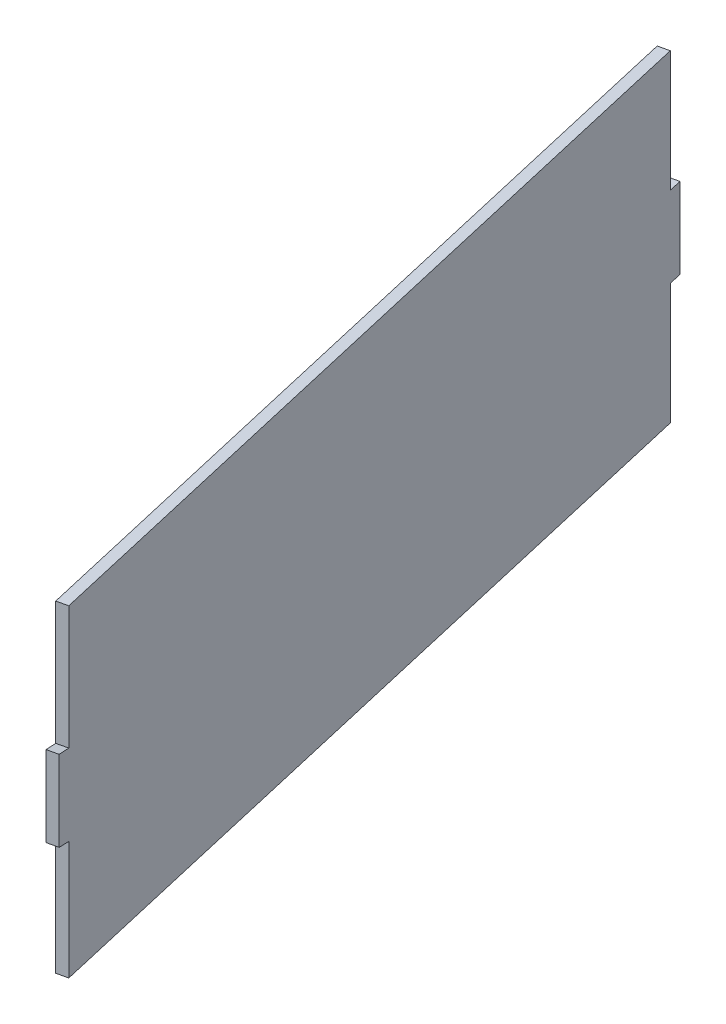
ISO-10303-21;
HEADER;
FILE_DESCRIPTION(('STEP AP214'),'2;1');
FILE_NAME('part.step','',(''),(''),'','','');
FILE_SCHEMA(('AUTOMOTIVE_DESIGN { 1 0 10303 214 1 1 1 1 }'));
ENDSEC;
DATA;
#1=APPLICATION_CONTEXT('core data for automotive mechanical design processes');
#2=APPLICATION_PROTOCOL_DEFINITION('international standard','automotive_design',2000,#1);
#3=PRODUCT_CONTEXT('',#1,'mechanical');
#4=PRODUCT('Part','Part','',(#3));
#5=PRODUCT_RELATED_PRODUCT_CATEGORY('part','',(#4));
#6=PRODUCT_DEFINITION_FORMATION('','',#4);
#7=PRODUCT_DEFINITION_CONTEXT('part definition',#1,'design');
#8=PRODUCT_DEFINITION('design','',#6,#7);
#9=PRODUCT_DEFINITION_SHAPE('','',#8);
#10=(LENGTH_UNIT() NAMED_UNIT(*) SI_UNIT(.MILLI.,.METRE.));
#11=(NAMED_UNIT(*) PLANE_ANGLE_UNIT() SI_UNIT($,.RADIAN.));
#12=(NAMED_UNIT(*) SI_UNIT($,.STERADIAN.) SOLID_ANGLE_UNIT());
#13=UNCERTAINTY_MEASURE_WITH_UNIT(LENGTH_MEASURE(1.E-05),#10,'distance_accuracy_value','');
#14=(GEOMETRIC_REPRESENTATION_CONTEXT(3) GLOBAL_UNCERTAINTY_ASSIGNED_CONTEXT((#13)) GLOBAL_UNIT_ASSIGNED_CONTEXT((#10,
#11,#12)) REPRESENTATION_CONTEXT('',''));
#15=CARTESIAN_POINT('',(0.,0.,0.));
#16=DIRECTION('',(0.,0.,1.));
#17=DIRECTION('',(1.,0.,0.));
#18=AXIS2_PLACEMENT_3D('',#15,#16,#17);
#19=CARTESIAN_POINT('',(242.32124406599,-154.081628831697,-2778.07964852124));
#20=DIRECTION('',(0.,1.,0.));
#21=DIRECTION('',(-1.,0.,0.));
#22=AXIS2_PLACEMENT_3D('',#19,#20,#21);
#23=PLANE('',#22);
#24=DIRECTION('',(0.224432003343937,0.,0.974489751549511));
#25=VECTOR('',#24,1.);
#26=CARTESIAN_POINT('',(252.222059941733,-154.081628831697,-2780.35987767521));
#27=LINE('',#26,#25);
#28=CARTESIAN_POINT('',(249.528875901606,-154.081628831697,-2792.05375469381));
#29=VERTEX_POINT('',#28);
#30=CARTESIAN_POINT('',(252.222059941733,-154.081628831697,-2780.35987767521));
#31=VERTEX_POINT('',#30);
#32=EDGE_CURVE('E160',#29,#31,#27,.T.);
#33=ORIENTED_EDGE('',*,*,#32,.F.);
#34=DIRECTION('',(0.974489751549511,0.,-0.224432003343935));
#35=VECTOR('',#34,1.);
#36=CARTESIAN_POINT('',(239.628060025863,-154.081628831697,-2789.77352553983));
#37=LINE('',#36,#35);
#38=CARTESIAN_POINT('',(239.628060025863,-154.081628831697,-2789.77352553983));
#39=VERTEX_POINT('',#38);
#40=EDGE_CURVE('E11',#39,#29,#37,.T.);
#41=ORIENTED_EDGE('',*,*,#40,.F.);
#42=DIRECTION('',(0.224432003343937,0.,0.974489751549511));
#43=VECTOR('',#42,1.);
#44=CARTESIAN_POINT('',(242.32124406599,-154.081628831697,-2778.07964852124));
#45=LINE('',#44,#43);
#46=CARTESIAN_POINT('',(242.32124406599,-154.081628831697,-2778.07964852124));
#47=VERTEX_POINT('',#46);
#48=EDGE_CURVE('E192',#39,#47,#45,.T.);
#49=ORIENTED_EDGE('',*,*,#48,.T.);
#50=DIRECTION('',(0.974489751549511,0.,-0.224432003343935));
#51=VECTOR('',#50,1.);
#52=CARTESIAN_POINT('',(242.32124406599,-154.081628831697,-2778.07964852124));
#53=LINE('',#52,#51);
#54=EDGE_CURVE('E42',#47,#31,#53,.T.);
#55=ORIENTED_EDGE('',*,*,#54,.T.);
#56=EDGE_LOOP('',(#33,#41,#49,#55));
#57=FACE_BOUND('',#56,.T.);
#58=ADVANCED_FACE('F39',(#57),#23,.T.);
#59=CARTESIAN_POINT('',(239.628060025863,-154.081628831697,-2789.77352553983));
#60=DIRECTION('',(-0.224432003343935,0.,-0.974489751549511));
#61=DIRECTION('',(-0.974489751549511,0.,0.224432003343935));
#62=AXIS2_PLACEMENT_3D('',#59,#60,#61);
#63=PLANE('',#62);
#64=DIRECTION('',(0.,1.,0.));
#65=VECTOR('',#64,1.);
#66=CARTESIAN_POINT('',(249.528875901606,-154.081628831697,-2792.05375469381));
#67=LINE('',#66,#65);
#68=CARTESIAN_POINT('',(249.528875901606,-229.081628831698,-2792.05375469381));
#69=VERTEX_POINT('',#68);
#70=EDGE_CURVE('E190',#69,#29,#67,.T.);
#71=ORIENTED_EDGE('',*,*,#70,.F.);
#72=DIRECTION('',(0.974489751549511,0.,-0.224432003343935));
#73=VECTOR('',#72,1.);
#74=CARTESIAN_POINT('',(239.628060025863,-229.081628831698,-2789.77352553983));
#75=LINE('',#74,#73);
#76=CARTESIAN_POINT('',(239.628060025863,-229.081628831698,-2789.77352553983));
#77=VERTEX_POINT('',#76);
#78=EDGE_CURVE('E48',#77,#69,#75,.T.);
#79=ORIENTED_EDGE('',*,*,#78,.F.);
#80=DIRECTION('',(0.,1.,0.));
#81=VECTOR('',#80,1.);
#82=CARTESIAN_POINT('',(239.628060025863,-154.081628831697,-2789.77352553983));
#83=LINE('',#82,#81);
#84=EDGE_CURVE('E150',#77,#39,#83,.T.);
#85=ORIENTED_EDGE('',*,*,#84,.T.);
#86=ORIENTED_EDGE('',*,*,#40,.T.);
#87=EDGE_LOOP('',(#71,#79,#85,#86));
#88=FACE_BOUND('',#87,.T.);
#89=ADVANCED_FACE('F212',(#88),#63,.T.);
#90=CARTESIAN_POINT('',(239.628060025863,-229.081628831698,-2789.77352553983));
#91=DIRECTION('',(0.,-1.,0.));
#92=DIRECTION('',(1.,0.,0.));
#93=AXIS2_PLACEMENT_3D('',#90,#91,#92);
#94=PLANE('',#93);
#95=DIRECTION('',(-0.224432003343937,0.,-0.974489751549511));
#96=VECTOR('',#95,1.);
#97=CARTESIAN_POINT('',(249.528875901606,-229.081628831698,-2792.05375469381));
#98=LINE('',#97,#96);
#99=CARTESIAN_POINT('',(252.222059941733,-229.081628831698,-2780.35987767521));
#100=VERTEX_POINT('',#99);
#101=EDGE_CURVE('E137',#100,#69,#98,.T.);
#102=ORIENTED_EDGE('',*,*,#101,.F.);
#103=DIRECTION('',(0.974489751549511,0.,-0.224432003343935));
#104=VECTOR('',#103,1.);
#105=CARTESIAN_POINT('',(242.32124406599,-229.081628831698,-2778.07964852124));
#106=LINE('',#105,#104);
#107=CARTESIAN_POINT('',(242.32124406599,-229.081628831698,-2778.07964852124));
#108=VERTEX_POINT('',#107);
#109=EDGE_CURVE('E132',#108,#100,#106,.T.);
#110=ORIENTED_EDGE('',*,*,#109,.F.);
#111=DIRECTION('',(-0.224432003343937,0.,-0.974489751549511));
#112=VECTOR('',#111,1.);
#113=CARTESIAN_POINT('',(239.628060025863,-229.081628831698,-2789.77352553983));
#114=LINE('',#113,#112);
#115=EDGE_CURVE('E135',#108,#77,#114,.T.);
#116=ORIENTED_EDGE('',*,*,#115,.T.);
#117=ORIENTED_EDGE('',*,*,#78,.T.);
#118=EDGE_LOOP('',(#102,#110,#116,#117));
#119=FACE_BOUND('',#118,.T.);
#120=ADVANCED_FACE('F134',(#119),#94,.T.);
#121=CARTESIAN_POINT('',(242.32124406599,-229.081628831698,-2778.07964852124));
#122=DIRECTION('',(-0.224432003343935,0.,-0.974489751549511));
#123=DIRECTION('',(-0.974489751549511,0.,0.224432003343935));
#124=AXIS2_PLACEMENT_3D('',#121,#122,#123);
#125=PLANE('',#124);
#126=DIRECTION('',(0.,1.,0.));
#127=VECTOR('',#126,1.);
#128=CARTESIAN_POINT('',(252.222059941733,-229.081628831698,-2780.35987767521));
#129=LINE('',#128,#127);
#130=CARTESIAN_POINT('',(252.222059941733,-341.581628831697,-2780.35987767521));
#131=VERTEX_POINT('',#130);
#132=EDGE_CURVE('E187',#131,#100,#129,.T.);
#133=ORIENTED_EDGE('',*,*,#132,.F.);
#134=DIRECTION('',(0.974489751549511,0.,-0.224432003343935));
#135=VECTOR('',#134,1.);
#136=CARTESIAN_POINT('',(242.32124406599,-341.581628831697,-2778.07964852124));
#137=LINE('',#136,#135);
#138=CARTESIAN_POINT('',(242.32124406599,-341.581628831697,-2778.07964852124));
#139=VERTEX_POINT('',#138);
#140=EDGE_CURVE('E142',#139,#131,#137,.T.);
#141=ORIENTED_EDGE('',*,*,#140,.F.);
#142=DIRECTION('',(0.,1.,0.));
#143=VECTOR('',#142,1.);
#144=CARTESIAN_POINT('',(242.32124406599,-229.081628831698,-2778.07964852124));
#145=LINE('',#144,#143);
#146=EDGE_CURVE('E148',#139,#108,#145,.T.);
#147=ORIENTED_EDGE('',*,*,#146,.T.);
#148=ORIENTED_EDGE('',*,*,#109,.T.);
#149=EDGE_LOOP('',(#133,#141,#147,#148));
#150=FACE_BOUND('',#149,.T.);
#151=ADVANCED_FACE('F152',(#150),#125,.T.);
#152=CARTESIAN_POINT('',(242.32124406599,-341.581628831697,-2778.07964852124));
#153=DIRECTION('',(0.,-1.,0.));
#154=DIRECTION('',(1.,0.,0.));
#155=AXIS2_PLACEMENT_3D('',#152,#153,#154);
#156=PLANE('',#155);
#157=DIRECTION('',(-0.224432003343935,0.,-0.974489751549511));
#158=VECTOR('',#157,1.);
#159=CARTESIAN_POINT('',(252.222059941733,-341.581628831697,-2780.35987767521));
#160=LINE('',#159,#158);
#161=CARTESIAN_POINT('',(419.721789204409,-341.581628831697,-2053.07158045472));
#162=VERTEX_POINT('',#161);
#163=EDGE_CURVE('E184',#162,#131,#160,.T.);
#164=ORIENTED_EDGE('',*,*,#163,.F.);
#165=DIRECTION('',(0.974489751549511,0.,-0.224432003343935));
#166=VECTOR('',#165,1.);
#167=CARTESIAN_POINT('',(409.820973328666,-341.581628831697,-2050.79135130074));
#168=LINE('',#167,#166);
#169=CARTESIAN_POINT('',(409.820973328666,-341.581628831697,-2050.79135130074));
#170=VERTEX_POINT('',#169);
#171=EDGE_CURVE('E196',#170,#162,#168,.T.);
#172=ORIENTED_EDGE('',*,*,#171,.F.);
#173=DIRECTION('',(-0.224432003343935,0.,-0.974489751549511));
#174=VECTOR('',#173,1.);
#175=CARTESIAN_POINT('',(242.32124406599,-341.581628831697,-2778.07964852124));
#176=LINE('',#175,#174);
#177=EDGE_CURVE('E153',#170,#139,#176,.T.);
#178=ORIENTED_EDGE('',*,*,#177,.T.);
#179=ORIENTED_EDGE('',*,*,#140,.T.);
#180=EDGE_LOOP('',(#164,#172,#178,#179));
#181=FACE_BOUND('',#180,.T.);
#182=ADVANCED_FACE('F225',(#181),#156,.T.);
#183=CARTESIAN_POINT('',(409.820973328666,-231.512401326091,-2050.79135130074));
#184=DIRECTION('',(0.224432003343935,0.,0.974489751549511));
#185=DIRECTION('',(0.974489751549511,0.,-0.224432003343935));
#186=AXIS2_PLACEMENT_3D('',#183,#184,#185);
#187=PLANE('',#186);
#188=DIRECTION('',(0.,-1.,0.));
#189=VECTOR('',#188,1.);
#190=CARTESIAN_POINT('',(419.721789204409,-231.512401326091,-2053.07158045472));
#191=LINE('',#190,#189);
#192=CARTESIAN_POINT('',(419.721789204409,-231.512401326091,-2053.07158045472));
#193=VERTEX_POINT('',#192);
#194=EDGE_CURVE('E181',#193,#162,#191,.T.);
#195=ORIENTED_EDGE('',*,*,#194,.F.);
#196=DIRECTION('',(0.974489751549511,0.,-0.224432003343935));
#197=VECTOR('',#196,1.);
#198=CARTESIAN_POINT('',(409.820973328666,-231.512401326091,-2050.79135130074));
#199=LINE('',#198,#197);
#200=CARTESIAN_POINT('',(409.820973328666,-231.512401326091,-2050.79135130074));
#201=VERTEX_POINT('',#200);
#202=EDGE_CURVE('E198',#201,#193,#199,.T.);
#203=ORIENTED_EDGE('',*,*,#202,.F.);
#204=DIRECTION('',(0.,-1.,0.));
#205=VECTOR('',#204,1.);
#206=CARTESIAN_POINT('',(409.820973328666,-231.512401326091,-2050.79135130074));
#207=LINE('',#206,#205);
#208=EDGE_CURVE('E155',#201,#170,#207,.T.);
#209=ORIENTED_EDGE('',*,*,#208,.T.);
#210=ORIENTED_EDGE('',*,*,#171,.T.);
#211=EDGE_LOOP('',(#195,#203,#209,#210));
#212=FACE_BOUND('',#211,.T.);
#213=ADVANCED_FACE('F228',(#212),#187,.T.);
#214=CARTESIAN_POINT('',(412.514157368793,-229.081628831698,-2039.09747428215));
#215=DIRECTION('',(0.0445569798398018,-0.980094365221818,0.19346759627389));
#216=DIRECTION('',(0.,-0.193659930680787,-0.981068718922743));
#217=AXIS2_PLACEMENT_3D('',#214,#215,#216);
#218=PLANE('',#217);
#219=DIRECTION('',(-0.219964541852833,-0.198532202074226,-0.955091914460086));
#220=VECTOR('',#219,1.);
#221=CARTESIAN_POINT('',(422.414973244536,-229.081628831698,-2041.37770343612));
#222=LINE('',#221,#220);
#223=CARTESIAN_POINT('',(422.414973244536,-229.081628831698,-2041.37770343612));
#224=VERTEX_POINT('',#223);
#225=EDGE_CURVE('E178',#224,#193,#222,.T.);
#226=ORIENTED_EDGE('',*,*,#225,.F.);
#227=DIRECTION('',(0.974489751549511,0.,-0.224432003343935));
#228=VECTOR('',#227,1.);
#229=CARTESIAN_POINT('',(412.514157368793,-229.081628831698,-2039.09747428215));
#230=LINE('',#229,#228);
#231=CARTESIAN_POINT('',(412.514157368793,-229.081628831698,-2039.09747428215));
#232=VERTEX_POINT('',#231);
#233=EDGE_CURVE('E200',#232,#224,#230,.T.);
#234=ORIENTED_EDGE('',*,*,#233,.F.);
#235=DIRECTION('',(-0.219964541852833,-0.198532202074226,-0.955091914460086));
#236=VECTOR('',#235,1.);
#237=CARTESIAN_POINT('',(412.514157368793,-229.081628831698,-2039.09747428215));
#238=LINE('',#237,#236);
#239=EDGE_CURVE('E382',#232,#201,#238,.T.);
#240=ORIENTED_EDGE('',*,*,#239,.T.);
#241=ORIENTED_EDGE('',*,*,#202,.T.);
#242=EDGE_LOOP('',(#226,#234,#240,#241));
#243=FACE_BOUND('',#242,.T.);
#244=ADVANCED_FACE('F232',(#243),#218,.T.);
#245=CARTESIAN_POINT('',(412.514157368793,-154.081628831698,-2039.09747428215));
#246=DIRECTION('',(0.224432003343935,0.,0.974489751549511));
#247=DIRECTION('',(0.974489751549511,0.,-0.224432003343935));
#248=AXIS2_PLACEMENT_3D('',#245,#246,#247);
#249=PLANE('',#248);
#250=DIRECTION('',(0.,-1.,0.));
#251=VECTOR('',#250,1.);
#252=CARTESIAN_POINT('',(422.414973244536,-154.081628831698,-2041.37770343612));
#253=LINE('',#252,#251);
#254=CARTESIAN_POINT('',(422.414973244536,-154.081628831698,-2041.37770343612));
#255=VERTEX_POINT('',#254);
#256=EDGE_CURVE('E175',#255,#224,#253,.T.);
#257=ORIENTED_EDGE('',*,*,#256,.F.);
#258=DIRECTION('',(0.974489751549511,0.,-0.224432003343935));
#259=VECTOR('',#258,1.);
#260=CARTESIAN_POINT('',(412.514157368793,-154.081628831698,-2039.09747428215));
#261=LINE('',#260,#259);
#262=CARTESIAN_POINT('',(412.514157368793,-154.081628831698,-2039.09747428215));
#263=VERTEX_POINT('',#262);
#264=EDGE_CURVE('E202',#263,#255,#261,.T.);
#265=ORIENTED_EDGE('',*,*,#264,.F.);
#266=DIRECTION('',(0.,-1.,0.));
#267=VECTOR('',#266,1.);
#268=CARTESIAN_POINT('',(412.514157368793,-154.081628831698,-2039.09747428215));
#269=LINE('',#268,#267);
#270=EDGE_CURVE('E386',#263,#232,#269,.T.);
#271=ORIENTED_EDGE('',*,*,#270,.T.);
#272=ORIENTED_EDGE('',*,*,#233,.T.);
#273=EDGE_LOOP('',(#257,#265,#271,#272));
#274=FACE_BOUND('',#273,.T.);
#275=ADVANCED_FACE('F236',(#274),#249,.T.);
#276=CARTESIAN_POINT('',(412.514157368793,-154.081628831698,-2039.09747428215));
#277=DIRECTION('',(-0.0399824688444815,0.984003416879626,-0.173604947378586));
#278=DIRECTION('',(0.,0.173743876214061,0.98479087398194));
#279=AXIS2_PLACEMENT_3D('',#276,#277,#278);
#280=PLANE('',#279);
#281=DIRECTION('',(0.22084185814757,0.178149587620128,0.958901245238897));
#282=VECTOR('',#281,1.);
#283=CARTESIAN_POINT('',(422.414973244536,-154.081628831698,-2041.37770343612));
#284=LINE('',#283,#282);
#285=CARTESIAN_POINT('',(419.721789204408,-156.254177234243,-2053.07158045472));
#286=VERTEX_POINT('',#285);
#287=EDGE_CURVE('E172',#286,#255,#284,.T.);
#288=ORIENTED_EDGE('',*,*,#287,.F.);
#289=DIRECTION('',(0.974489751549511,0.,-0.224432003343935));
#290=VECTOR('',#289,1.);
#291=CARTESIAN_POINT('',(409.820973328665,-156.254177234243,-2050.79135130074));
#292=LINE('',#291,#290);
#293=CARTESIAN_POINT('',(409.820973328665,-156.254177234243,-2050.79135130074));
#294=VERTEX_POINT('',#293);
#295=EDGE_CURVE('E204',#294,#286,#292,.T.);
#296=ORIENTED_EDGE('',*,*,#295,.F.);
#297=DIRECTION('',(0.22084185814757,0.178149587620128,0.958901245238897));
#298=VECTOR('',#297,1.);
#299=CARTESIAN_POINT('',(412.514157368793,-154.081628831698,-2039.09747428215));
#300=LINE('',#299,#298);
#301=EDGE_CURVE('E375',#294,#263,#300,.T.);
#302=ORIENTED_EDGE('',*,*,#301,.T.);
#303=ORIENTED_EDGE('',*,*,#264,.T.);
#304=EDGE_LOOP('',(#288,#296,#302,#303));
#305=FACE_BOUND('',#304,.T.);
#306=ADVANCED_FACE('F240',(#305),#280,.T.);
#307=CARTESIAN_POINT('',(409.820973328665,-41.5816288316976,-2050.79135130074));
#308=DIRECTION('',(0.224432003343935,0.,0.974489751549511));
#309=DIRECTION('',(0.974489751549511,0.,-0.224432003343935));
#310=AXIS2_PLACEMENT_3D('',#307,#308,#309);
#311=PLANE('',#310);
#312=DIRECTION('',(0.,-1.,0.));
#313=VECTOR('',#312,1.);
#314=CARTESIAN_POINT('',(419.721789204408,-41.5816288316975,-2053.07158045472));
#315=LINE('',#314,#313);
#316=CARTESIAN_POINT('',(419.721789204408,-41.5816288316975,-2053.07158045472));
#317=VERTEX_POINT('',#316);
#318=EDGE_CURVE('E169',#317,#286,#315,.T.);
#319=ORIENTED_EDGE('',*,*,#318,.F.);
#320=DIRECTION('',(0.974489751549511,0.,-0.224432003343935));
#321=VECTOR('',#320,1.);
#322=CARTESIAN_POINT('',(409.820973328665,-41.5816288316976,-2050.79135130074));
#323=LINE('',#322,#321);
#324=CARTESIAN_POINT('',(409.820973328665,-41.5816288316976,-2050.79135130074));
#325=VERTEX_POINT('',#324);
#326=EDGE_CURVE('E206',#325,#317,#323,.T.);
#327=ORIENTED_EDGE('',*,*,#326,.F.);
#328=DIRECTION('',(0.,-1.,0.));
#329=VECTOR('',#328,1.);
#330=CARTESIAN_POINT('',(409.820973328665,-41.5816288316976,-2050.79135130074));
#331=LINE('',#330,#329);
#332=EDGE_CURVE('E371',#325,#294,#331,.T.);
#333=ORIENTED_EDGE('',*,*,#332,.T.);
#334=ORIENTED_EDGE('',*,*,#295,.T.);
#335=EDGE_LOOP('',(#319,#327,#333,#334));
#336=FACE_BOUND('',#335,.T.);
#337=ADVANCED_FACE('F244',(#336),#311,.T.);
#338=CARTESIAN_POINT('',(242.32124406599,-41.5816288316974,-2778.07964852124));
#339=DIRECTION('',(0.,1.,0.));
#340=DIRECTION('',(-1.,0.,0.));
#341=AXIS2_PLACEMENT_3D('',#338,#339,#340);
#342=PLANE('',#341);
#343=DIRECTION('',(0.224432003343935,0.,0.974489751549511));
#344=VECTOR('',#343,1.);
#345=CARTESIAN_POINT('',(252.222059941733,-41.5816288316974,-2780.35987767521));
#346=LINE('',#345,#344);
#347=CARTESIAN_POINT('',(252.222059941733,-41.5816288316974,-2780.35987767521));
#348=VERTEX_POINT('',#347);
#349=EDGE_CURVE('E166',#348,#317,#346,.T.);
#350=ORIENTED_EDGE('',*,*,#349,.F.);
#351=DIRECTION('',(0.974489751549511,0.,-0.224432003343935));
#352=VECTOR('',#351,1.);
#353=CARTESIAN_POINT('',(242.32124406599,-41.5816288316974,-2778.07964852124));
#354=LINE('',#353,#352);
#355=CARTESIAN_POINT('',(242.32124406599,-41.5816288316974,-2778.07964852124));
#356=VERTEX_POINT('',#355);
#357=EDGE_CURVE('E207',#356,#348,#354,.T.);
#358=ORIENTED_EDGE('',*,*,#357,.F.);
#359=DIRECTION('',(0.224432003343935,0.,0.974489751549511));
#360=VECTOR('',#359,1.);
#361=CARTESIAN_POINT('',(242.32124406599,-41.5816288316974,-2778.07964852124));
#362=LINE('',#361,#360);
#363=EDGE_CURVE('E392',#356,#325,#362,.T.);
#364=ORIENTED_EDGE('',*,*,#363,.T.);
#365=ORIENTED_EDGE('',*,*,#326,.T.);
#366=EDGE_LOOP('',(#350,#358,#364,#365));
#367=FACE_BOUND('',#366,.T.);
#368=ADVANCED_FACE('F248',(#367),#342,.T.);
#369=CARTESIAN_POINT('',(242.32124406599,-41.5816288316974,-2778.07964852124));
#370=DIRECTION('',(-0.224432003343935,0.,-0.974489751549511));
#371=DIRECTION('',(-0.974489751549511,0.,0.224432003343935));
#372=AXIS2_PLACEMENT_3D('',#369,#370,#371);
#373=PLANE('',#372);
#374=DIRECTION('',(0.,1.,0.));
#375=VECTOR('',#374,1.);
#376=CARTESIAN_POINT('',(252.222059941733,-41.5816288316974,-2780.35987767521));
#377=LINE('',#376,#375);
#378=EDGE_CURVE('E163',#31,#348,#377,.T.);
#379=ORIENTED_EDGE('',*,*,#378,.F.);
#380=ORIENTED_EDGE('',*,*,#54,.F.);
#381=DIRECTION('',(0.,1.,0.));
#382=VECTOR('',#381,1.);
#383=CARTESIAN_POINT('',(242.32124406599,-41.5816288316974,-2778.07964852124));
#384=LINE('',#383,#382);
#385=EDGE_CURVE('E394',#47,#356,#384,.T.);
#386=ORIENTED_EDGE('',*,*,#385,.T.);
#387=ORIENTED_EDGE('',*,*,#357,.T.);
#388=EDGE_LOOP('',(#379,#380,#386,#387));
#389=FACE_BOUND('',#388,.T.);
#390=ADVANCED_FACE('F209',(#389),#373,.T.);
#391=CARTESIAN_POINT('',(837.700186498557,0.,-192.928382015836));
#392=DIRECTION('',(-0.974489751549511,0.,0.224432003343937));
#393=DIRECTION('',(0.224432003343937,0.,0.974489751549511));
#394=AXIS2_PLACEMENT_3D('',#391,#392,#393);
#395=PLANE('',#394);
#396=ORIENTED_EDGE('',*,*,#48,.F.);
#397=ORIENTED_EDGE('',*,*,#84,.F.);
#398=ORIENTED_EDGE('',*,*,#115,.F.);
#399=ORIENTED_EDGE('',*,*,#146,.F.);
#400=ORIENTED_EDGE('',*,*,#177,.F.);
#401=ORIENTED_EDGE('',*,*,#208,.F.);
#402=ORIENTED_EDGE('',*,*,#239,.F.);
#403=ORIENTED_EDGE('',*,*,#270,.F.);
#404=ORIENTED_EDGE('',*,*,#301,.F.);
#405=ORIENTED_EDGE('',*,*,#332,.F.);
#406=ORIENTED_EDGE('',*,*,#363,.F.);
#407=ORIENTED_EDGE('',*,*,#385,.F.);
#408=EDGE_LOOP('',(#396,#397,#398,#399,#400,#401,#402,#403,#404,#405,#406,#407));
#409=FACE_BOUND('',#408,.T.);
#410=ADVANCED_FACE('F146',(#409),#395,.T.);
#411=CARTESIAN_POINT('',(847.6010023743,0.,-195.20861116981));
#412=DIRECTION('',(-0.974489751549511,0.,0.224432003343937));
#413=DIRECTION('',(0.224432003343937,0.,0.974489751549511));
#414=AXIS2_PLACEMENT_3D('',#411,#412,#413);
#415=PLANE('',#414);
#416=ORIENTED_EDGE('',*,*,#32,.T.);
#417=ORIENTED_EDGE('',*,*,#378,.T.);
#418=ORIENTED_EDGE('',*,*,#349,.T.);
#419=ORIENTED_EDGE('',*,*,#318,.T.);
#420=ORIENTED_EDGE('',*,*,#287,.T.);
#421=ORIENTED_EDGE('',*,*,#256,.T.);
#422=ORIENTED_EDGE('',*,*,#225,.T.);
#423=ORIENTED_EDGE('',*,*,#194,.T.);
#424=ORIENTED_EDGE('',*,*,#163,.T.);
#425=ORIENTED_EDGE('',*,*,#132,.T.);
#426=ORIENTED_EDGE('',*,*,#101,.T.);
#427=ORIENTED_EDGE('',*,*,#70,.T.);
#428=EDGE_LOOP('',(#416,#417,#418,#419,#420,#421,#422,#423,#424,#425,#426,#427));
#429=FACE_BOUND('',#428,.T.);
#430=ADVANCED_FACE('F211',(#429),#415,.F.);
#431=CLOSED_SHELL('',(#58,#89,#120,#151,#182,#213,#244,#275,#306,#337,#368,#390,#410,#430));
#432=MANIFOLD_SOLID_BREP('B2',#431);
#433=ADVANCED_BREP_SHAPE_REPRESENTATION('',(#18,#432),#14);
#434=SHAPE_DEFINITION_REPRESENTATION(#9,#433);
ENDSEC;
END-ISO-10303-21;
